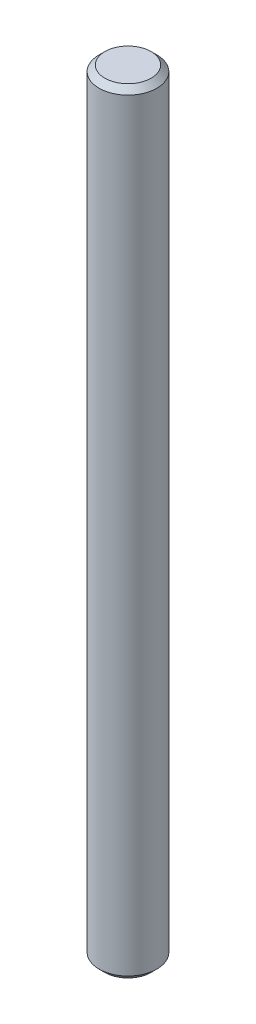
ISO-10303-21;
HEADER;
FILE_DESCRIPTION(('STEP AP214'),'2;1');
FILE_NAME('part.step','',(''),(''),'','','');
FILE_SCHEMA(('AUTOMOTIVE_DESIGN { 1 0 10303 214 1 1 1 1 }'));
ENDSEC;
DATA;
#1=APPLICATION_CONTEXT('core data for automotive mechanical design processes');
#2=APPLICATION_PROTOCOL_DEFINITION('international standard','automotive_design',2000,#1);
#3=PRODUCT_CONTEXT('',#1,'mechanical');
#4=PRODUCT('Part','Part','',(#3));
#5=PRODUCT_RELATED_PRODUCT_CATEGORY('part','',(#4));
#6=PRODUCT_DEFINITION_FORMATION('','',#4);
#7=PRODUCT_DEFINITION_CONTEXT('part definition',#1,'design');
#8=PRODUCT_DEFINITION('design','',#6,#7);
#9=PRODUCT_DEFINITION_SHAPE('','',#8);
#10=(LENGTH_UNIT() NAMED_UNIT(*) SI_UNIT(.MILLI.,.METRE.));
#11=(NAMED_UNIT(*) PLANE_ANGLE_UNIT() SI_UNIT($,.RADIAN.));
#12=(NAMED_UNIT(*) SI_UNIT($,.STERADIAN.) SOLID_ANGLE_UNIT());
#13=UNCERTAINTY_MEASURE_WITH_UNIT(LENGTH_MEASURE(1.E-05),#10,'distance_accuracy_value','');
#14=(GEOMETRIC_REPRESENTATION_CONTEXT(3) GLOBAL_UNCERTAINTY_ASSIGNED_CONTEXT((#13)) GLOBAL_UNIT_ASSIGNED_CONTEXT((#10,
#11,#12)) REPRESENTATION_CONTEXT('',''));
#15=CARTESIAN_POINT('',(0.,0.,0.));
#16=DIRECTION('',(0.,0.,1.));
#17=DIRECTION('',(1.,0.,0.));
#18=AXIS2_PLACEMENT_3D('',#15,#16,#17);
#19=CARTESIAN_POINT('',(0.,67.,0.));
#20=DIRECTION('',(0.,-1.,0.));
#21=DIRECTION('',(0.,0.,-1.));
#22=AXIS2_PLACEMENT_3D('',#19,#20,#21);
#23=CYLINDRICAL_SURFACE('',#22,2.5);
#24=CARTESIAN_POINT('',(0.,66.5,0.));
#25=DIRECTION('',(0.,1.,0.));
#26=DIRECTION('',(0.,0.,1.));
#27=AXIS2_PLACEMENT_3D('',#24,#25,#26);
#28=CIRCLE('',#27,2.5);
#29=CARTESIAN_POINT('',(0.,66.5,2.5));
#30=VERTEX_POINT('',#29);
#31=EDGE_CURVE('E49',#30,#30,#28,.F.);
#32=ORIENTED_EDGE('',*,*,#31,.T.);
#33=EDGE_LOOP('',(#32));
#34=FACE_BOUND('',#33,.T.);
#35=CARTESIAN_POINT('',(0.,0.499999999999973,0.));
#36=DIRECTION('',(0.,1.,0.));
#37=DIRECTION('',(0.,0.,1.));
#38=AXIS2_PLACEMENT_3D('',#35,#36,#37);
#39=CIRCLE('',#38,2.5);
#40=CARTESIAN_POINT('',(0.,0.499999999999973,2.5));
#41=VERTEX_POINT('',#40);
#42=EDGE_CURVE('E53',#41,#41,#39,.T.);
#43=ORIENTED_EDGE('',*,*,#42,.T.);
#44=EDGE_LOOP('',(#43));
#45=FACE_BOUND('',#44,.T.);
#46=ADVANCED_FACE('F41',(#34,#45),#23,.T.);
#47=CARTESIAN_POINT('',(0.,67.,0.));
#48=DIRECTION('',(0.,1.,0.));
#49=DIRECTION('',(0.,0.,1.));
#50=AXIS2_PLACEMENT_3D('',#47,#48,#49);
#51=PLANE('',#50);
#52=CARTESIAN_POINT('',(0.,67.,0.));
#53=DIRECTION('',(0.,1.,0.));
#54=DIRECTION('',(0.,0.,1.));
#55=AXIS2_PLACEMENT_3D('',#52,#53,#54);
#56=CIRCLE('',#55,2.);
#57=CARTESIAN_POINT('',(0.,67.,2.));
#58=VERTEX_POINT('',#57);
#59=EDGE_CURVE('E57',#58,#58,#56,.T.);
#60=ORIENTED_EDGE('',*,*,#59,.T.);
#61=EDGE_LOOP('',(#60));
#62=FACE_BOUND('',#61,.T.);
#63=ADVANCED_FACE('F63',(#62),#51,.T.);
#64=CARTESIAN_POINT('',(0.,0.,0.));
#65=DIRECTION('',(0.,1.,0.));
#66=DIRECTION('',(0.,0.,1.));
#67=AXIS2_PLACEMENT_3D('',#64,#65,#66);
#68=PLANE('',#67);
#69=CARTESIAN_POINT('',(0.,0.,0.));
#70=DIRECTION('',(0.,1.,0.));
#71=DIRECTION('',(0.,0.,1.));
#72=AXIS2_PLACEMENT_3D('',#69,#70,#71);
#73=CIRCLE('',#72,2.00000000000002);
#74=CARTESIAN_POINT('',(0.,0.,2.00000000000002));
#75=VERTEX_POINT('',#74);
#76=EDGE_CURVE('E10',#75,#75,#73,.F.);
#77=ORIENTED_EDGE('',*,*,#76,.T.);
#78=EDGE_LOOP('',(#77));
#79=FACE_BOUND('',#78,.T.);
#80=ADVANCED_FACE('F67',(#79),#68,.F.);
#81=CARTESIAN_POINT('',(0.,67.,0.));
#82=DIRECTION('',(0.,-1.,0.));
#83=DIRECTION('',(0.,0.,-1.));
#84=AXIS2_PLACEMENT_3D('',#81,#82,#83);
#85=CONICAL_SURFACE('',#84,2.,0.785398163397446);
#86=ORIENTED_EDGE('',*,*,#31,.F.);
#87=EDGE_LOOP('',(#86));
#88=FACE_BOUND('',#87,.T.);
#89=ORIENTED_EDGE('',*,*,#59,.F.);
#90=EDGE_LOOP('',(#89));
#91=FACE_BOUND('',#90,.T.);
#92=ADVANCED_FACE('F65',(#88,#91),#85,.T.);
#93=CARTESIAN_POINT('',(0.,0.499999999999973,0.));
#94=DIRECTION('',(0.,1.,0.));
#95=DIRECTION('',(0.,0.,1.));
#96=AXIS2_PLACEMENT_3D('',#93,#94,#95);
#97=CONICAL_SURFACE('',#96,2.5,0.78539816339746);
#98=ORIENTED_EDGE('',*,*,#76,.F.);
#99=EDGE_LOOP('',(#98));
#100=FACE_BOUND('',#99,.T.);
#101=ORIENTED_EDGE('',*,*,#42,.F.);
#102=EDGE_LOOP('',(#101));
#103=FACE_BOUND('',#102,.T.);
#104=ADVANCED_FACE('F44',(#100,#103),#97,.T.);
#105=CLOSED_SHELL('',(#46,#63,#80,#92,#104));
#106=MANIFOLD_SOLID_BREP('B2',#105);
#107=ADVANCED_BREP_SHAPE_REPRESENTATION('',(#18,#106),#14);
#108=SHAPE_DEFINITION_REPRESENTATION(#9,#107);
ENDSEC;
END-ISO-10303-21;
